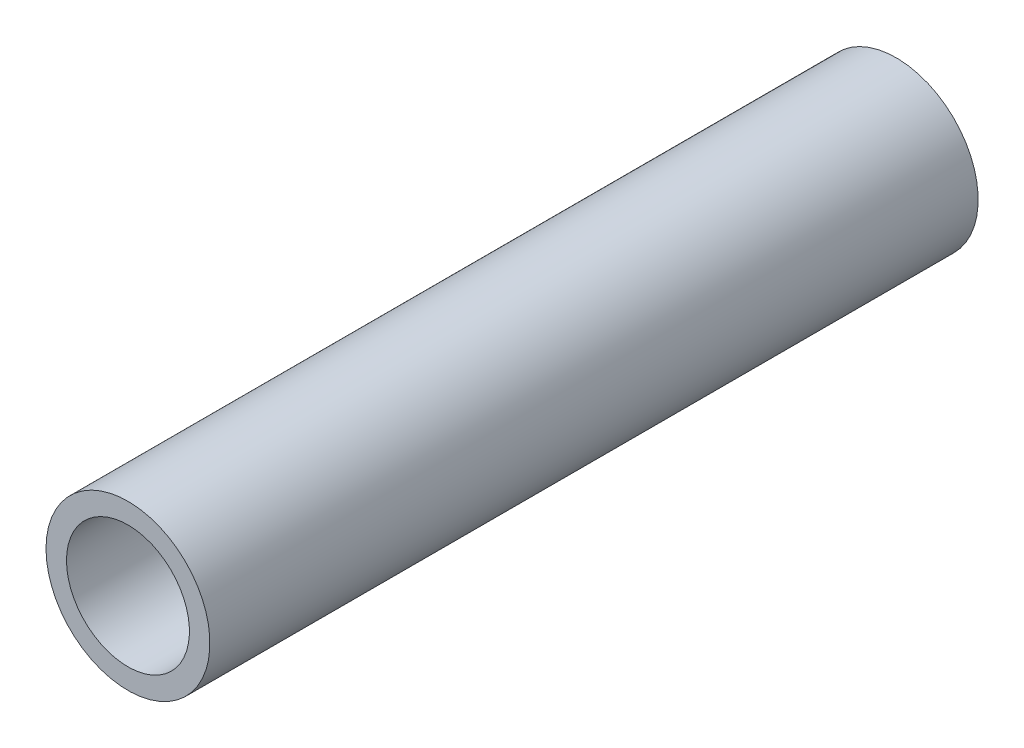
ISO-10303-21;
HEADER;
FILE_DESCRIPTION(('STEP AP214'),'2;1');
FILE_NAME('part.step','',(''),(''),'','','');
FILE_SCHEMA(('AUTOMOTIVE_DESIGN { 1 0 10303 214 1 1 1 1 }'));
ENDSEC;
DATA;
#1=APPLICATION_CONTEXT('core data for automotive mechanical design processes');
#2=APPLICATION_PROTOCOL_DEFINITION('international standard','automotive_design',2000,#1);
#3=PRODUCT_CONTEXT('',#1,'mechanical');
#4=PRODUCT('Part','Part','',(#3));
#5=PRODUCT_RELATED_PRODUCT_CATEGORY('part','',(#4));
#6=PRODUCT_DEFINITION_FORMATION('','',#4);
#7=PRODUCT_DEFINITION_CONTEXT('part definition',#1,'design');
#8=PRODUCT_DEFINITION('design','',#6,#7);
#9=PRODUCT_DEFINITION_SHAPE('','',#8);
#10=(LENGTH_UNIT() NAMED_UNIT(*) SI_UNIT(.MILLI.,.METRE.));
#11=(NAMED_UNIT(*) PLANE_ANGLE_UNIT() SI_UNIT($,.RADIAN.));
#12=(NAMED_UNIT(*) SI_UNIT($,.STERADIAN.) SOLID_ANGLE_UNIT());
#13=UNCERTAINTY_MEASURE_WITH_UNIT(LENGTH_MEASURE(1.E-05),#10,'distance_accuracy_value','');
#14=(GEOMETRIC_REPRESENTATION_CONTEXT(3) GLOBAL_UNCERTAINTY_ASSIGNED_CONTEXT((#13)) GLOBAL_UNIT_ASSIGNED_CONTEXT((#10,
#11,#12)) REPRESENTATION_CONTEXT('',''));
#15=CARTESIAN_POINT('',(0.,0.,0.));
#16=DIRECTION('',(0.,0.,1.));
#17=DIRECTION('',(1.,0.,0.));
#18=AXIS2_PLACEMENT_3D('',#15,#16,#17);
#19=CARTESIAN_POINT('',(180.,21.,27.));
#20=DIRECTION('',(0.,0.,-1.));
#21=DIRECTION('',(-1.,0.,0.));
#22=AXIS2_PLACEMENT_3D('',#19,#20,#21);
#23=PLANE('',#22);
#24=CARTESIAN_POINT('',(180.,21.,27.));
#25=DIRECTION('',(0.,0.,-1.));
#26=DIRECTION('',(-1.,0.,0.));
#27=AXIS2_PLACEMENT_3D('',#24,#25,#26);
#28=CIRCLE('',#27,3.);
#29=CARTESIAN_POINT('',(177.,21.,27.));
#30=VERTEX_POINT('',#29);
#31=EDGE_CURVE('E65',#30,#30,#28,.T.);
#32=ORIENTED_EDGE('',*,*,#31,.T.);
#33=EDGE_LOOP('',(#32));
#34=FACE_BOUND('',#33,.T.);
#35=CARTESIAN_POINT('',(180.,21.,27.));
#36=DIRECTION('',(0.,0.,-1.));
#37=DIRECTION('',(-1.,0.,0.));
#38=AXIS2_PLACEMENT_3D('',#35,#36,#37);
#39=CIRCLE('',#38,4.);
#40=CARTESIAN_POINT('',(176.,21.,27.));
#41=VERTEX_POINT('',#40);
#42=EDGE_CURVE('E51',#41,#41,#39,.T.);
#43=ORIENTED_EDGE('',*,*,#42,.F.);
#44=EDGE_LOOP('',(#43));
#45=FACE_BOUND('',#44,.T.);
#46=ADVANCED_FACE('F50',(#34,#45),#23,.F.);
#47=CARTESIAN_POINT('',(180.,21.,-10.5));
#48=DIRECTION('',(0.,0.,-1.));
#49=DIRECTION('',(-1.,0.,0.));
#50=AXIS2_PLACEMENT_3D('',#47,#48,#49);
#51=PLANE('',#50);
#52=CARTESIAN_POINT('',(180.,21.,-10.5));
#53=DIRECTION('',(0.,0.,-1.));
#54=DIRECTION('',(-1.,0.,0.));
#55=AXIS2_PLACEMENT_3D('',#52,#53,#54);
#56=CIRCLE('',#55,3.);
#57=CARTESIAN_POINT('',(177.,21.,-10.5));
#58=VERTEX_POINT('',#57);
#59=EDGE_CURVE('E59',#58,#58,#56,.T.);
#60=ORIENTED_EDGE('',*,*,#59,.F.);
#61=EDGE_LOOP('',(#60));
#62=FACE_BOUND('',#61,.T.);
#63=CARTESIAN_POINT('',(180.,21.,-10.5));
#64=DIRECTION('',(0.,0.,-1.));
#65=DIRECTION('',(-1.,0.,0.));
#66=AXIS2_PLACEMENT_3D('',#63,#64,#65);
#67=CIRCLE('',#66,4.);
#68=CARTESIAN_POINT('',(176.,21.,-10.5));
#69=VERTEX_POINT('',#68);
#70=EDGE_CURVE('E11',#69,#69,#67,.T.);
#71=ORIENTED_EDGE('',*,*,#70,.T.);
#72=EDGE_LOOP('',(#71));
#73=FACE_BOUND('',#72,.T.);
#74=ADVANCED_FACE('F73',(#62,#73),#51,.T.);
#75=CARTESIAN_POINT('',(180.,21.,27.));
#76=DIRECTION('',(0.,0.,-1.));
#77=DIRECTION('',(-1.,0.,0.));
#78=AXIS2_PLACEMENT_3D('',#75,#76,#77);
#79=CYLINDRICAL_SURFACE('',#78,4.);
#80=ORIENTED_EDGE('',*,*,#70,.F.);
#81=EDGE_LOOP('',(#80));
#82=FACE_BOUND('',#81,.T.);
#83=ORIENTED_EDGE('',*,*,#42,.T.);
#84=EDGE_LOOP('',(#83));
#85=FACE_BOUND('',#84,.T.);
#86=ADVANCED_FACE('F47',(#82,#85),#79,.T.);
#87=CARTESIAN_POINT('',(180.,21.,27.));
#88=DIRECTION('',(0.,0.,-1.));
#89=DIRECTION('',(-1.,0.,0.));
#90=AXIS2_PLACEMENT_3D('',#87,#88,#89);
#91=CYLINDRICAL_SURFACE('',#90,3.);
#92=ORIENTED_EDGE('',*,*,#59,.T.);
#93=EDGE_LOOP('',(#92));
#94=FACE_BOUND('',#93,.T.);
#95=ORIENTED_EDGE('',*,*,#31,.F.);
#96=EDGE_LOOP('',(#95));
#97=FACE_BOUND('',#96,.T.);
#98=ADVANCED_FACE('F68',(#94,#97),#91,.F.);
#99=CLOSED_SHELL('',(#46,#74,#86,#98));
#100=MANIFOLD_SOLID_BREP('B2',#99);
#101=ADVANCED_BREP_SHAPE_REPRESENTATION('',(#18,#100),#14);
#102=SHAPE_DEFINITION_REPRESENTATION(#9,#101);
ENDSEC;
END-ISO-10303-21;
